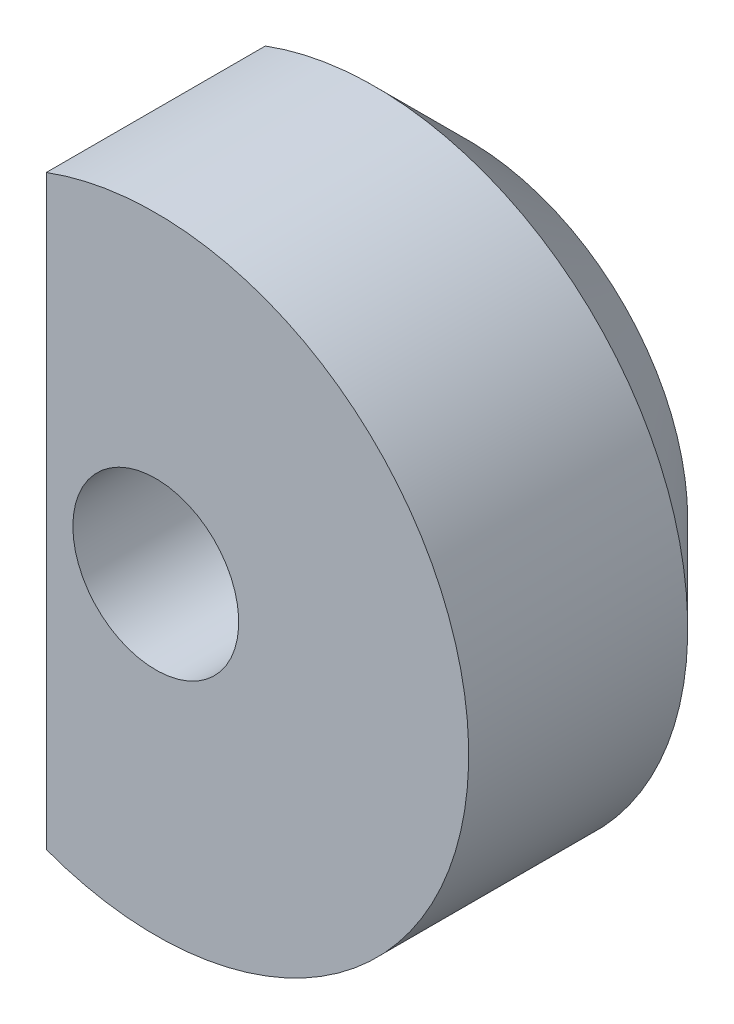
ISO-10303-21;
HEADER;
FILE_DESCRIPTION(('STEP AP214'),'2;1');
FILE_NAME('part.step','',(''),(''),'','','');
FILE_SCHEMA(('AUTOMOTIVE_DESIGN { 1 0 10303 214 1 1 1 1 }'));
ENDSEC;
DATA;
#1=APPLICATION_CONTEXT('core data for automotive mechanical design processes');
#2=APPLICATION_PROTOCOL_DEFINITION('international standard','automotive_design',2000,#1);
#3=PRODUCT_CONTEXT('',#1,'mechanical');
#4=PRODUCT('Part','Part','',(#3));
#5=PRODUCT_RELATED_PRODUCT_CATEGORY('part','',(#4));
#6=PRODUCT_DEFINITION_FORMATION('','',#4);
#7=PRODUCT_DEFINITION_CONTEXT('part definition',#1,'design');
#8=PRODUCT_DEFINITION('design','',#6,#7);
#9=PRODUCT_DEFINITION_SHAPE('','',#8);
#10=(LENGTH_UNIT() NAMED_UNIT(*) SI_UNIT(.MILLI.,.METRE.));
#11=(NAMED_UNIT(*) PLANE_ANGLE_UNIT() SI_UNIT($,.RADIAN.));
#12=(NAMED_UNIT(*) SI_UNIT($,.STERADIAN.) SOLID_ANGLE_UNIT());
#13=UNCERTAINTY_MEASURE_WITH_UNIT(LENGTH_MEASURE(1.E-05),#10,'distance_accuracy_value','');
#14=(GEOMETRIC_REPRESENTATION_CONTEXT(3) GLOBAL_UNCERTAINTY_ASSIGNED_CONTEXT((#13)) GLOBAL_UNIT_ASSIGNED_CONTEXT((#10,
#11,#12)) REPRESENTATION_CONTEXT('',''));
#15=CARTESIAN_POINT('',(0.,0.,0.));
#16=DIRECTION('',(0.,0.,1.));
#17=DIRECTION('',(1.,0.,0.));
#18=AXIS2_PLACEMENT_3D('',#15,#16,#17);
#19=CARTESIAN_POINT('',(0.,0.,10.));
#20=DIRECTION('',(0.,0.,-1.));
#21=DIRECTION('',(-1.,0.,0.));
#22=AXIS2_PLACEMENT_3D('',#19,#20,#21);
#23=CYLINDRICAL_SURFACE('',#22,10.);
#24=DIRECTION('',(0.,0.,-1.));
#25=VECTOR('',#24,1.);
#26=CARTESIAN_POINT('',(-3.5,-9.3674969975976,10.));
#27=LINE('',#26,#25);
#28=CARTESIAN_POINT('',(-3.5,-9.3674969975976,10.));
#29=VERTEX_POINT('',#28);
#30=CARTESIAN_POINT('',(-3.5,-9.3674969975976,3.));
#31=VERTEX_POINT('',#30);
#32=EDGE_CURVE('E115',#29,#31,#27,.T.);
#33=ORIENTED_EDGE('',*,*,#32,.T.);
#34=CARTESIAN_POINT('',(0.,0.,3.));
#35=DIRECTION('',(0.,0.,1.));
#36=DIRECTION('',(1.,0.,0.));
#37=AXIS2_PLACEMENT_3D('',#34,#35,#36);
#38=CIRCLE('',#37,10.);
#39=CARTESIAN_POINT('',(-3.5,9.3674969975976,3.));
#40=VERTEX_POINT('',#39);
#41=EDGE_CURVE('E88',#31,#40,#38,.T.);
#42=ORIENTED_EDGE('',*,*,#41,.T.);
#43=DIRECTION('',(0.,0.,-1.));
#44=VECTOR('',#43,1.);
#45=CARTESIAN_POINT('',(-3.5,9.3674969975976,10.));
#46=LINE('',#45,#44);
#47=CARTESIAN_POINT('',(-3.5,9.3674969975976,10.));
#48=VERTEX_POINT('',#47);
#49=EDGE_CURVE('E89',#48,#40,#46,.T.);
#50=ORIENTED_EDGE('',*,*,#49,.F.);
#51=CARTESIAN_POINT('',(0.,0.,10.));
#52=DIRECTION('',(0.,0.,1.));
#53=DIRECTION('',(1.,0.,0.));
#54=AXIS2_PLACEMENT_3D('',#51,#52,#53);
#55=CIRCLE('',#54,10.);
#56=EDGE_CURVE('E110',#29,#48,#55,.T.);
#57=ORIENTED_EDGE('',*,*,#56,.F.);
#58=EDGE_LOOP('',(#33,#42,#50,#57));
#59=FACE_BOUND('',#58,.T.);
#60=ADVANCED_FACE('F35',(#59),#23,.T.);
#61=CARTESIAN_POINT('',(-3.5,9.3674969975976,10.));
#62=DIRECTION('',(1.,0.,0.));
#63=DIRECTION('',(0.,0.,-1.));
#64=AXIS2_PLACEMENT_3D('',#61,#62,#63);
#65=PLANE('',#64);
#66=ORIENTED_EDGE('',*,*,#49,.T.);
#67=CARTESIAN_POINT('',(-3.5,9.3674969975976,3.));
#68=CARTESIAN_POINT('',(-3.5,9.09597383820853,2.74570749516282));
#69=CARTESIAN_POINT('',(-3.5,8.82382567380506,2.49207569166963));
#70=CARTESIAN_POINT('',(-3.5,8.27780918471244,1.98672066755213));
#71=CARTESIAN_POINT('',(-3.5,8.00394101527847,1.73499727906743));
#72=CARTESIAN_POINT('',(-3.5,7.45395412268931,1.23398978848123));
#73=CARTESIAN_POINT('',(-3.5,7.1778353011452,0.98470579407935));
#74=CARTESIAN_POINT('',(-3.5,6.76138416692138,0.613302953213714));
#75=CARTESIAN_POINT('',(-3.5,6.62218205216906,0.489917089941316));
#76=CARTESIAN_POINT('',(-3.5,6.3428841525715,0.244157081636119));
#77=CARTESIAN_POINT('',(-3.5,6.20278835409227,0.121782952103977));
#78=CARTESIAN_POINT('',(-3.5,6.06217782649106,0.));
#79=B_SPLINE_CURVE_WITH_KNOTS('',3,(#67,#68,#69,#70,#71,#72,#73,#74,#75,#76,#77,#78),
.UNSPECIFIED.,.F.,.F.,(4,2,2,2,2,4),(0.,1.11602759722802,2.23195586469011,3.34793318025855,
3.90597156890972,4.46401849141894),.UNSPECIFIED.);
#80=CARTESIAN_POINT('',(-3.5,6.06217782649106,0.));
#81=VERTEX_POINT('',#80);
#82=EDGE_CURVE('E45',#40,#81,#79,.T.);
#83=ORIENTED_EDGE('',*,*,#82,.T.);
#84=DIRECTION('',(0.,-1.,0.));
#85=VECTOR('',#84,1.);
#86=CARTESIAN_POINT('',(-3.5,9.3674969975976,0.));
#87=LINE('',#86,#85);
#88=CARTESIAN_POINT('',(-3.5,5.02039839056623,0.));
#89=VERTEX_POINT('',#88);
#90=EDGE_CURVE('E101',#81,#89,#87,.T.);
#91=ORIENTED_EDGE('',*,*,#90,.T.);
#92=DIRECTION('',(0.,0.,-1.));
#93=VECTOR('',#92,1.);
#94=CARTESIAN_POINT('',(-3.5,5.02039839056623,0.));
#95=LINE('',#94,#93);
#96=CARTESIAN_POINT('',(-3.5,5.02039839056623,3.58));
#97=VERTEX_POINT('',#96);
#98=EDGE_CURVE('E94',#89,#97,#95,.F.);
#99=ORIENTED_EDGE('',*,*,#98,.T.);
#100=DIRECTION('',(0.,-1.,0.));
#101=VECTOR('',#100,1.);
#102=CARTESIAN_POINT('',(-3.5,9.3674969975976,3.58));
#103=LINE('',#102,#101);
#104=CARTESIAN_POINT('',(-3.5,-5.02039839056623,3.58));
#105=VERTEX_POINT('',#104);
#106=EDGE_CURVE('E82',#97,#105,#103,.T.);
#107=ORIENTED_EDGE('',*,*,#106,.T.);
#108=DIRECTION('',(0.,0.,-1.));
#109=VECTOR('',#108,1.);
#110=CARTESIAN_POINT('',(-3.5,-5.02039839056623,0.));
#111=LINE('',#110,#109);
#112=CARTESIAN_POINT('',(-3.5,-5.02039839056623,0.));
#113=VERTEX_POINT('',#112);
#114=EDGE_CURVE('E96',#105,#113,#111,.T.);
#115=ORIENTED_EDGE('',*,*,#114,.T.);
#116=CARTESIAN_POINT('',(-3.5,-6.06217782649106,0.));
#117=VERTEX_POINT('',#116);
#118=EDGE_CURVE('E104',#113,#117,#87,.T.);
#119=ORIENTED_EDGE('',*,*,#118,.T.);
#120=CARTESIAN_POINT('',(-3.5,-6.06217782649106,0.));
#121=CARTESIAN_POINT('',(-3.5,-6.20278835409227,0.121782952103976));
#122=CARTESIAN_POINT('',(-3.5,-6.3428841525715,0.244157081636119));
#123=CARTESIAN_POINT('',(-3.5,-6.62218205216906,0.489917089941316));
#124=CARTESIAN_POINT('',(-3.5,-6.76138416692138,0.613302953213714));
#125=CARTESIAN_POINT('',(-3.5,-7.1778353011452,0.98470579407935));
#126=CARTESIAN_POINT('',(-3.5,-7.45395412268931,1.23398978848123));
#127=CARTESIAN_POINT('',(-3.5,-8.00394101527847,1.73499727906743));
#128=CARTESIAN_POINT('',(-3.5,-8.27780918471244,1.98672066755213));
#129=CARTESIAN_POINT('',(-3.5,-8.82382567380506,2.49207569166964));
#130=CARTESIAN_POINT('',(-3.5,-9.09597383820853,2.74570749516282));
#131=CARTESIAN_POINT('',(-3.5,-9.3674969975976,3.));
#132=B_SPLINE_CURVE_WITH_KNOTS('',3,(#120,#121,#122,#123,#124,#125,#126,#127,#128,#129,#130,
#131),.UNSPECIFIED.,.F.,.F.,(4,2,2,2,2,4),(0.,0.558046922509228,1.1160853111604,
2.23206262672884,3.34799089419092,4.46401849141895),.UNSPECIFIED.);
#133=EDGE_CURVE('E122',#117,#31,#132,.T.);
#134=ORIENTED_EDGE('',*,*,#133,.T.);
#135=ORIENTED_EDGE('',*,*,#32,.F.);
#136=DIRECTION('',(0.,-1.,0.));
#137=VECTOR('',#136,1.);
#138=CARTESIAN_POINT('',(-3.5,9.3674969975976,10.));
#139=LINE('',#138,#137);
#140=EDGE_CURVE('E113',#48,#29,#139,.T.);
#141=ORIENTED_EDGE('',*,*,#140,.F.);
#142=EDGE_LOOP('',(#66,#83,#91,#99,#107,#115,#119,#134,#135,#141));
#143=FACE_BOUND('',#142,.T.);
#144=ADVANCED_FACE('F100',(#143),#65,.F.);
#145=CARTESIAN_POINT('',(0.,0.,10.));
#146=DIRECTION('',(0.,0.,1.));
#147=DIRECTION('',(1.,0.,0.));
#148=AXIS2_PLACEMENT_3D('',#145,#146,#147);
#149=PLANE('',#148);
#150=CARTESIAN_POINT('',(0.,0.,10.));
#151=DIRECTION('',(0.,0.,-1.));
#152=DIRECTION('',(-1.,0.,0.));
#153=AXIS2_PLACEMENT_3D('',#150,#151,#152);
#154=CIRCLE('',#153,2.65);
#155=CARTESIAN_POINT('',(-2.65,0.,10.));
#156=VERTEX_POINT('',#155);
#157=EDGE_CURVE('E102',#156,#156,#154,.T.);
#158=ORIENTED_EDGE('',*,*,#157,.T.);
#159=EDGE_LOOP('',(#158));
#160=FACE_BOUND('',#159,.T.);
#161=ORIENTED_EDGE('',*,*,#56,.T.);
#162=ORIENTED_EDGE('',*,*,#140,.T.);
#163=EDGE_LOOP('',(#161,#162));
#164=FACE_BOUND('',#163,.T.);
#165=ADVANCED_FACE('F135',(#160,#164),#149,.T.);
#166=CARTESIAN_POINT('',(0.,0.,0.));
#167=DIRECTION('',(0.,0.,1.));
#168=DIRECTION('',(1.,0.,0.));
#169=AXIS2_PLACEMENT_3D('',#166,#167,#168);
#170=PLANE('',#169);
#171=ORIENTED_EDGE('',*,*,#90,.F.);
#172=CARTESIAN_POINT('',(0.,0.,0.));
#173=DIRECTION('',(0.,0.,1.));
#174=DIRECTION('',(1.,0.,0.));
#175=AXIS2_PLACEMENT_3D('',#172,#173,#174);
#176=CIRCLE('',#175,6.99999999999999);
#177=EDGE_CURVE('E11',#81,#117,#176,.F.);
#178=ORIENTED_EDGE('',*,*,#177,.T.);
#179=ORIENTED_EDGE('',*,*,#118,.F.);
#180=CARTESIAN_POINT('',(0.,0.,0.));
#181=DIRECTION('',(0.,0.,-1.));
#182=DIRECTION('',(-1.,0.,0.));
#183=AXIS2_PLACEMENT_3D('',#180,#181,#182);
#184=CIRCLE('',#183,6.12);
#185=EDGE_CURVE('E98',#89,#113,#184,.T.);
#186=ORIENTED_EDGE('',*,*,#185,.F.);
#187=EDGE_LOOP('',(#171,#178,#179,#186));
#188=FACE_BOUND('',#187,.T.);
#189=ADVANCED_FACE('F136',(#188),#170,.F.);
#190=CARTESIAN_POINT('',(2.65,0.,3.58));
#191=DIRECTION('',(0.,0.,1.));
#192=DIRECTION('',(1.,0.,0.));
#193=AXIS2_PLACEMENT_3D('',#190,#191,#192);
#194=PLANE('',#193);
#195=CARTESIAN_POINT('',(0.,0.,3.58));
#196=DIRECTION('',(0.,0.,-1.));
#197=DIRECTION('',(-1.,0.,0.));
#198=AXIS2_PLACEMENT_3D('',#195,#196,#197);
#199=CIRCLE('',#198,2.65);
#200=CARTESIAN_POINT('',(-2.65,0.,3.58));
#201=VERTEX_POINT('',#200);
#202=EDGE_CURVE('E97',#201,#201,#199,.T.);
#203=ORIENTED_EDGE('',*,*,#202,.F.);
#204=EDGE_LOOP('',(#203));
#205=FACE_BOUND('',#204,.T.);
#206=CARTESIAN_POINT('',(0.,0.,3.58));
#207=DIRECTION('',(0.,0.,-1.));
#208=DIRECTION('',(-1.,0.,0.));
#209=AXIS2_PLACEMENT_3D('',#206,#207,#208);
#210=CIRCLE('',#209,6.12);
#211=EDGE_CURVE('E85',#97,#105,#210,.T.);
#212=ORIENTED_EDGE('',*,*,#211,.T.);
#213=ORIENTED_EDGE('',*,*,#106,.F.);
#214=EDGE_LOOP('',(#212,#213));
#215=FACE_BOUND('',#214,.T.);
#216=ADVANCED_FACE('F84',(#205,#215),#194,.F.);
#217=CARTESIAN_POINT('',(0.,0.,0.));
#218=DIRECTION('',(0.,0.,-1.));
#219=DIRECTION('',(-1.,0.,0.));
#220=AXIS2_PLACEMENT_3D('',#217,#218,#219);
#221=CYLINDRICAL_SURFACE('',#220,6.12);
#222=ORIENTED_EDGE('',*,*,#211,.F.);
#223=ORIENTED_EDGE('',*,*,#98,.F.);
#224=ORIENTED_EDGE('',*,*,#185,.T.);
#225=ORIENTED_EDGE('',*,*,#114,.F.);
#226=EDGE_LOOP('',(#222,#223,#224,#225));
#227=FACE_BOUND('',#226,.T.);
#228=ADVANCED_FACE('F93',(#227),#221,.F.);
#229=CARTESIAN_POINT('',(0.,0.,0.));
#230=DIRECTION('',(0.,0.,-1.));
#231=DIRECTION('',(-1.,0.,0.));
#232=AXIS2_PLACEMENT_3D('',#229,#230,#231);
#233=CYLINDRICAL_SURFACE('',#232,2.65);
#234=ORIENTED_EDGE('',*,*,#157,.F.);
#235=EDGE_LOOP('',(#234));
#236=FACE_BOUND('',#235,.T.);
#237=ORIENTED_EDGE('',*,*,#202,.T.);
#238=EDGE_LOOP('',(#237));
#239=FACE_BOUND('',#238,.T.);
#240=ADVANCED_FACE('F153',(#236,#239),#233,.F.);
#241=CARTESIAN_POINT('',(0.,0.,3.));
#242=DIRECTION('',(0.,0.,1.));
#243=DIRECTION('',(1.,0.,0.));
#244=AXIS2_PLACEMENT_3D('',#241,#242,#243);
#245=CONICAL_SURFACE('',#244,10.,0.78539816339745);
#246=ORIENTED_EDGE('',*,*,#133,.F.);
#247=ORIENTED_EDGE('',*,*,#177,.F.);
#248=ORIENTED_EDGE('',*,*,#82,.F.);
#249=ORIENTED_EDGE('',*,*,#41,.F.);
#250=EDGE_LOOP('',(#246,#247,#248,#249));
#251=FACE_BOUND('',#250,.T.);
#252=ADVANCED_FACE('F38',(#251),#245,.T.);
#253=CLOSED_SHELL('',(#60,#144,#165,#189,#216,#228,#240,#252));
#254=MANIFOLD_SOLID_BREP('B2',#253);
#255=ADVANCED_BREP_SHAPE_REPRESENTATION('',(#18,#254),#14);
#256=SHAPE_DEFINITION_REPRESENTATION(#9,#255);
ENDSEC;
END-ISO-10303-21;
